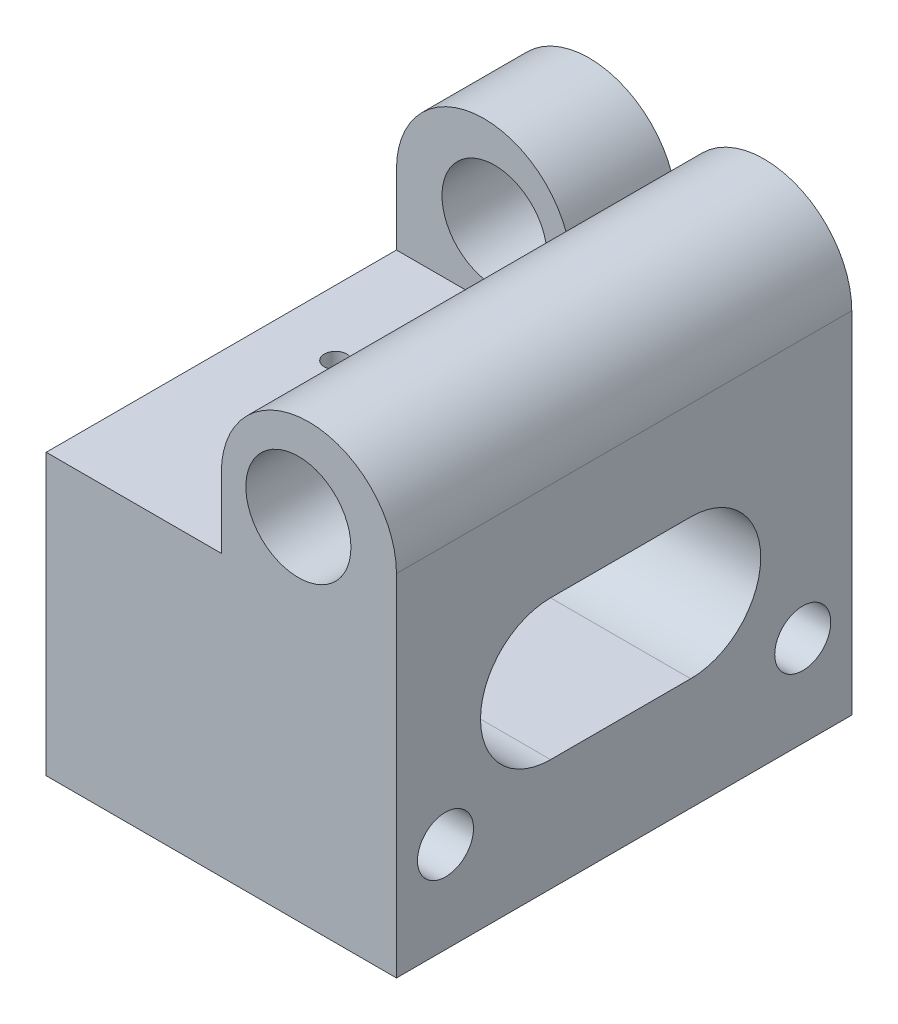
ISO-10303-21;
HEADER;
FILE_DESCRIPTION(('STEP AP214'),'2;1');
FILE_NAME('part.step','',(''),(''),'','','');
FILE_SCHEMA(('AUTOMOTIVE_DESIGN { 1 0 10303 214 1 1 1 1 }'));
ENDSEC;
DATA;
#1=APPLICATION_CONTEXT('core data for automotive mechanical design processes');
#2=APPLICATION_PROTOCOL_DEFINITION('international standard','automotive_design',2000,#1);
#3=PRODUCT_CONTEXT('',#1,'mechanical');
#4=PRODUCT('Part','Part','',(#3));
#5=PRODUCT_RELATED_PRODUCT_CATEGORY('part','',(#4));
#6=PRODUCT_DEFINITION_FORMATION('','',#4);
#7=PRODUCT_DEFINITION_CONTEXT('part definition',#1,'design');
#8=PRODUCT_DEFINITION('design','',#6,#7);
#9=PRODUCT_DEFINITION_SHAPE('','',#8);
#10=(LENGTH_UNIT() NAMED_UNIT(*) SI_UNIT(.MILLI.,.METRE.));
#11=(NAMED_UNIT(*) PLANE_ANGLE_UNIT() SI_UNIT($,.RADIAN.));
#12=(NAMED_UNIT(*) SI_UNIT($,.STERADIAN.) SOLID_ANGLE_UNIT());
#13=UNCERTAINTY_MEASURE_WITH_UNIT(LENGTH_MEASURE(1.E-05),#10,'distance_accuracy_value','');
#14=(GEOMETRIC_REPRESENTATION_CONTEXT(3) GLOBAL_UNCERTAINTY_ASSIGNED_CONTEXT((#13)) GLOBAL_UNIT_ASSIGNED_CONTEXT((#10,
#11,#12)) REPRESENTATION_CONTEXT('',''));
#15=CARTESIAN_POINT('',(0.,0.,0.));
#16=DIRECTION('',(0.,0.,1.));
#17=DIRECTION('',(1.,0.,0.));
#18=AXIS2_PLACEMENT_3D('',#15,#16,#17);
#19=CARTESIAN_POINT('',(36.,50.,0.));
#20=DIRECTION('',(0.,0.,1.));
#21=DIRECTION('',(1.,0.,0.));
#22=AXIS2_PLACEMENT_3D('',#19,#20,#21);
#23=PLANE('',#22);
#24=CARTESIAN_POINT('',(36.,50.,0.));
#25=DIRECTION('',(0.,0.,1.));
#26=DIRECTION('',(1.,0.,0.));
#27=AXIS2_PLACEMENT_3D('',#24,#25,#26);
#28=CIRCLE('',#27,7.5);
#29=CARTESIAN_POINT('',(43.5,50.,0.));
#30=VERTEX_POINT('',#29);
#31=EDGE_CURVE('E171',#30,#30,#28,.T.);
#32=ORIENTED_EDGE('',*,*,#31,.T.);
#33=EDGE_LOOP('',(#32));
#34=FACE_BOUND('',#33,.T.);
#35=CARTESIAN_POINT('',(14.,50.,0.));
#36=DIRECTION('',(0.,0.,1.));
#37=DIRECTION('',(1.,0.,0.));
#38=AXIS2_PLACEMENT_3D('',#35,#36,#37);
#39=CIRCLE('',#38,7.5);
#40=CARTESIAN_POINT('',(21.5,50.,0.));
#41=VERTEX_POINT('',#40);
#42=EDGE_CURVE('E167',#41,#41,#39,.T.);
#43=ORIENTED_EDGE('',*,*,#42,.T.);
#44=EDGE_LOOP('',(#43));
#45=FACE_BOUND('',#44,.T.);
#46=CARTESIAN_POINT('',(37.5,50.,0.));
#47=DIRECTION('',(0.,0.,1.));
#48=DIRECTION('',(1.,0.,0.));
#49=AXIS2_PLACEMENT_3D('',#46,#47,#48);
#50=CIRCLE('',#49,12.5);
#51=CARTESIAN_POINT('',(50.,50.,0.));
#52=VERTEX_POINT('',#51);
#53=CARTESIAN_POINT('',(25.,50.,0.));
#54=VERTEX_POINT('',#53);
#55=EDGE_CURVE('E128',#52,#54,#50,.T.);
#56=ORIENTED_EDGE('',*,*,#55,.F.);
#57=DIRECTION('',(0.,1.,0.));
#58=VECTOR('',#57,1.);
#59=CARTESIAN_POINT('',(50.,0.,0.));
#60=LINE('',#59,#58);
#61=CARTESIAN_POINT('',(50.,0.,0.));
#62=VERTEX_POINT('',#61);
#63=EDGE_CURVE('E142',#62,#52,#60,.T.);
#64=ORIENTED_EDGE('',*,*,#63,.F.);
#65=DIRECTION('',(1.,0.,0.));
#66=VECTOR('',#65,1.);
#67=CARTESIAN_POINT('',(0.,0.,0.));
#68=LINE('',#67,#66);
#69=CARTESIAN_POINT('',(0.,0.,0.));
#70=VERTEX_POINT('',#69);
#71=EDGE_CURVE('E150',#70,#62,#68,.T.);
#72=ORIENTED_EDGE('',*,*,#71,.F.);
#73=DIRECTION('',(0.,-1.,0.));
#74=VECTOR('',#73,1.);
#75=CARTESIAN_POINT('',(0.,50.,0.));
#76=LINE('',#75,#74);
#77=CARTESIAN_POINT('',(0.,50.,0.));
#78=VERTEX_POINT('',#77);
#79=EDGE_CURVE('E154',#78,#70,#76,.T.);
#80=ORIENTED_EDGE('',*,*,#79,.F.);
#81=CARTESIAN_POINT('',(12.5,50.,0.));
#82=DIRECTION('',(0.,0.,1.));
#83=DIRECTION('',(1.,0.,0.));
#84=AXIS2_PLACEMENT_3D('',#81,#82,#83);
#85=CIRCLE('',#84,12.5);
#86=EDGE_CURVE('E144',#78,#54,#85,.F.);
#87=ORIENTED_EDGE('',*,*,#86,.T.);
#88=EDGE_LOOP('',(#56,#64,#72,#80,#87));
#89=FACE_BOUND('',#88,.T.);
#90=ADVANCED_FACE('F38',(#34,#45,#89),#23,.F.);
#91=CARTESIAN_POINT('',(36.,50.,15.));
#92=DIRECTION('',(0.,0.,1.));
#93=DIRECTION('',(1.,0.,0.));
#94=AXIS2_PLACEMENT_3D('',#91,#92,#93);
#95=PLANE('',#94);
#96=CARTESIAN_POINT('',(12.5,50.,15.));
#97=DIRECTION('',(0.,0.,1.));
#98=DIRECTION('',(1.,0.,0.));
#99=AXIS2_PLACEMENT_3D('',#96,#97,#98);
#100=CIRCLE('',#99,12.5);
#101=CARTESIAN_POINT('',(0.,50.,15.));
#102=VERTEX_POINT('',#101);
#103=CARTESIAN_POINT('',(25.,50.,15.));
#104=VERTEX_POINT('',#103);
#105=EDGE_CURVE('E145',#102,#104,#100,.F.);
#106=ORIENTED_EDGE('',*,*,#105,.F.);
#107=DIRECTION('',(0.,-1.,0.));
#108=VECTOR('',#107,1.);
#109=CARTESIAN_POINT('',(0.,50.,15.));
#110=LINE('',#109,#108);
#111=CARTESIAN_POINT('',(0.,40.,15.));
#112=VERTEX_POINT('',#111);
#113=EDGE_CURVE('E149',#102,#112,#110,.T.);
#114=ORIENTED_EDGE('',*,*,#113,.T.);
#115=DIRECTION('',(-1.,0.,0.));
#116=VECTOR('',#115,1.);
#117=CARTESIAN_POINT('',(36.,40.,15.));
#118=LINE('',#117,#116);
#119=CARTESIAN_POINT('',(25.,40.,15.));
#120=VERTEX_POINT('',#119);
#121=EDGE_CURVE('E183',#120,#112,#118,.T.);
#122=ORIENTED_EDGE('',*,*,#121,.F.);
#123=DIRECTION('',(0.,-1.,0.));
#124=VECTOR('',#123,1.);
#125=CARTESIAN_POINT('',(25.,0.,15.));
#126=LINE('',#125,#124);
#127=EDGE_CURVE('E179',#104,#120,#126,.T.);
#128=ORIENTED_EDGE('',*,*,#127,.F.);
#129=EDGE_LOOP('',(#106,#114,#122,#128));
#130=FACE_BOUND('',#129,.T.);
#131=CARTESIAN_POINT('',(14.,50.,15.));
#132=DIRECTION('',(0.,0.,1.));
#133=DIRECTION('',(1.,0.,0.));
#134=AXIS2_PLACEMENT_3D('',#131,#132,#133);
#135=CIRCLE('',#134,7.5);
#136=CARTESIAN_POINT('',(21.5,50.,15.));
#137=VERTEX_POINT('',#136);
#138=EDGE_CURVE('E165',#137,#137,#135,.T.);
#139=ORIENTED_EDGE('',*,*,#138,.F.);
#140=EDGE_LOOP('',(#139));
#141=FACE_BOUND('',#140,.T.);
#142=ADVANCED_FACE('F294',(#130,#141),#95,.T.);
#143=CARTESIAN_POINT('',(0.,50.,15.));
#144=DIRECTION('',(1.,0.,0.));
#145=DIRECTION('',(0.,0.,-1.));
#146=AXIS2_PLACEMENT_3D('',#143,#144,#145);
#147=PLANE('',#146);
#148=CARTESIAN_POINT('',(0.,13.,58.));
#149=DIRECTION('',(-1.,0.,0.));
#150=DIRECTION('',(0.,0.,1.));
#151=AXIS2_PLACEMENT_3D('',#148,#149,#150);
#152=CIRCLE('',#151,4.);
#153=CARTESIAN_POINT('',(0.,13.,62.));
#154=VERTEX_POINT('',#153);
#155=EDGE_CURVE('E245',#154,#154,#152,.T.);
#156=ORIENTED_EDGE('',*,*,#155,.F.);
#157=EDGE_LOOP('',(#156));
#158=FACE_BOUND('',#157,.T.);
#159=CARTESIAN_POINT('',(0.,13.,7.));
#160=DIRECTION('',(-1.,0.,0.));
#161=DIRECTION('',(0.,0.,1.));
#162=AXIS2_PLACEMENT_3D('',#159,#160,#161);
#163=CIRCLE('',#162,4.);
#164=CARTESIAN_POINT('',(0.,13.,11.));
#165=VERTEX_POINT('',#164);
#166=EDGE_CURVE('E238',#165,#165,#163,.T.);
#167=ORIENTED_EDGE('',*,*,#166,.F.);
#168=EDGE_LOOP('',(#167));
#169=FACE_BOUND('',#168,.T.);
#170=DIRECTION('',(0.,0.,1.));
#171=VECTOR('',#170,1.);
#172=CARTESIAN_POINT('',(0.,16.,23.));
#173=LINE('',#172,#171);
#174=CARTESIAN_POINT('',(0.,16.,23.));
#175=VERTEX_POINT('',#174);
#176=CARTESIAN_POINT('',(0.,16.,43.));
#177=VERTEX_POINT('',#176);
#178=EDGE_CURVE('E221',#175,#177,#173,.T.);
#179=ORIENTED_EDGE('',*,*,#178,.F.);
#180=CARTESIAN_POINT('',(0.,26.,23.));
#181=DIRECTION('',(-1.,0.,0.));
#182=DIRECTION('',(0.,0.,1.));
#183=AXIS2_PLACEMENT_3D('',#180,#181,#182);
#184=CIRCLE('',#183,10.);
#185=CARTESIAN_POINT('',(0.,36.,23.));
#186=VERTEX_POINT('',#185);
#187=EDGE_CURVE('E54',#186,#175,#184,.T.);
#188=ORIENTED_EDGE('',*,*,#187,.F.);
#189=DIRECTION('',(0.,0.,-1.));
#190=VECTOR('',#189,1.);
#191=CARTESIAN_POINT('',(0.,36.,23.));
#192=LINE('',#191,#190);
#193=CARTESIAN_POINT('',(0.,36.,43.));
#194=VERTEX_POINT('',#193);
#195=EDGE_CURVE('E214',#194,#186,#192,.T.);
#196=ORIENTED_EDGE('',*,*,#195,.F.);
#197=CARTESIAN_POINT('',(0.,26.,43.));
#198=DIRECTION('',(-1.,0.,0.));
#199=DIRECTION('',(0.,0.,1.));
#200=AXIS2_PLACEMENT_3D('',#197,#198,#199);
#201=CIRCLE('',#200,10.);
#202=EDGE_CURVE('E218',#177,#194,#201,.T.);
#203=ORIENTED_EDGE('',*,*,#202,.F.);
#204=EDGE_LOOP('',(#179,#188,#196,#203));
#205=FACE_BOUND('',#204,.T.);
#206=ORIENTED_EDGE('',*,*,#79,.T.);
#207=DIRECTION('',(0.,0.,-1.));
#208=VECTOR('',#207,1.);
#209=CARTESIAN_POINT('',(0.,0.,15.));
#210=LINE('',#209,#208);
#211=CARTESIAN_POINT('',(0.,0.,65.));
#212=VERTEX_POINT('',#211);
#213=EDGE_CURVE('E11',#212,#70,#210,.T.);
#214=ORIENTED_EDGE('',*,*,#213,.F.);
#215=DIRECTION('',(0.,1.,0.));
#216=VECTOR('',#215,1.);
#217=CARTESIAN_POINT('',(0.,0.,65.));
#218=LINE('',#217,#216);
#219=CARTESIAN_POINT('',(0.,40.,65.));
#220=VERTEX_POINT('',#219);
#221=EDGE_CURVE('E202',#212,#220,#218,.T.);
#222=ORIENTED_EDGE('',*,*,#221,.T.);
#223=DIRECTION('',(0.,0.,-1.));
#224=VECTOR('',#223,1.);
#225=CARTESIAN_POINT('',(0.,40.,65.));
#226=LINE('',#225,#224);
#227=EDGE_CURVE('E198',#220,#112,#226,.T.);
#228=ORIENTED_EDGE('',*,*,#227,.T.);
#229=ORIENTED_EDGE('',*,*,#113,.F.);
#230=DIRECTION('',(0.,0.,-1.));
#231=VECTOR('',#230,1.);
#232=CARTESIAN_POINT('',(0.,50.,15.));
#233=LINE('',#232,#231);
#234=EDGE_CURVE('E136',#102,#78,#233,.T.);
#235=ORIENTED_EDGE('',*,*,#234,.T.);
#236=EDGE_LOOP('',(#206,#214,#222,#228,#229,#235));
#237=FACE_BOUND('',#236,.T.);
#238=ADVANCED_FACE('F40',(#158,#169,#205,#237),#147,.F.);
#239=CARTESIAN_POINT('',(0.,0.,15.));
#240=DIRECTION('',(0.,1.,0.));
#241=DIRECTION('',(0.,0.,1.));
#242=AXIS2_PLACEMENT_3D('',#239,#240,#241);
#243=PLANE('',#242);
#244=CARTESIAN_POINT('',(9.30614492508849,0.,33.));
#245=DIRECTION('',(0.,1.,0.));
#246=DIRECTION('',(0.,0.,1.));
#247=AXIS2_PLACEMENT_3D('',#244,#245,#246);
#248=CIRCLE('',#247,1.6);
#249=CARTESIAN_POINT('',(9.30614492508849,0.,34.6));
#250=VERTEX_POINT('',#249);
#251=EDGE_CURVE('E255',#250,#250,#248,.T.);
#252=ORIENTED_EDGE('',*,*,#251,.T.);
#253=EDGE_LOOP('',(#252));
#254=FACE_BOUND('',#253,.T.);
#255=ORIENTED_EDGE('',*,*,#71,.T.);
#256=DIRECTION('',(0.,0.,-1.));
#257=VECTOR('',#256,1.);
#258=CARTESIAN_POINT('',(50.,0.,15.));
#259=LINE('',#258,#257);
#260=CARTESIAN_POINT('',(50.,0.,65.));
#261=VERTEX_POINT('',#260);
#262=EDGE_CURVE('E47',#261,#62,#259,.T.);
#263=ORIENTED_EDGE('',*,*,#262,.F.);
#264=DIRECTION('',(1.,0.,0.));
#265=VECTOR('',#264,1.);
#266=CARTESIAN_POINT('',(0.,0.,65.));
#267=LINE('',#266,#265);
#268=EDGE_CURVE('E178',#212,#261,#267,.T.);
#269=ORIENTED_EDGE('',*,*,#268,.F.);
#270=ORIENTED_EDGE('',*,*,#213,.T.);
#271=EDGE_LOOP('',(#255,#263,#269,#270));
#272=FACE_BOUND('',#271,.T.);
#273=ADVANCED_FACE('F307',(#254,#272),#243,.F.);
#274=CARTESIAN_POINT('',(50.,0.,15.));
#275=DIRECTION('',(-1.,0.,0.));
#276=DIRECTION('',(0.,0.,1.));
#277=AXIS2_PLACEMENT_3D('',#274,#275,#276);
#278=PLANE('',#277);
#279=CARTESIAN_POINT('',(50.,13.,58.));
#280=DIRECTION('',(-1.,0.,0.));
#281=DIRECTION('',(0.,0.,1.));
#282=AXIS2_PLACEMENT_3D('',#279,#280,#281);
#283=CIRCLE('',#282,4.);
#284=CARTESIAN_POINT('',(50.,13.,62.));
#285=VERTEX_POINT('',#284);
#286=EDGE_CURVE('E236',#285,#285,#283,.T.);
#287=ORIENTED_EDGE('',*,*,#286,.T.);
#288=EDGE_LOOP('',(#287));
#289=FACE_BOUND('',#288,.T.);
#290=CARTESIAN_POINT('',(50.,13.,7.));
#291=DIRECTION('',(-1.,0.,0.));
#292=DIRECTION('',(0.,0.,1.));
#293=AXIS2_PLACEMENT_3D('',#290,#291,#292);
#294=CIRCLE('',#293,4.);
#295=CARTESIAN_POINT('',(50.,13.,11.));
#296=VERTEX_POINT('',#295);
#297=EDGE_CURVE('E241',#296,#296,#294,.T.);
#298=ORIENTED_EDGE('',*,*,#297,.T.);
#299=EDGE_LOOP('',(#298));
#300=FACE_BOUND('',#299,.T.);
#301=DIRECTION('',(0.,0.,-1.));
#302=VECTOR('',#301,1.);
#303=CARTESIAN_POINT('',(50.,36.,23.));
#304=LINE('',#303,#302);
#305=CARTESIAN_POINT('',(50.,36.,43.));
#306=VERTEX_POINT('',#305);
#307=CARTESIAN_POINT('',(50.,36.,23.));
#308=VERTEX_POINT('',#307);
#309=EDGE_CURVE('E209',#306,#308,#304,.T.);
#310=ORIENTED_EDGE('',*,*,#309,.T.);
#311=CARTESIAN_POINT('',(50.,26.,23.));
#312=DIRECTION('',(-1.,0.,0.));
#313=DIRECTION('',(0.,0.,1.));
#314=AXIS2_PLACEMENT_3D('',#311,#312,#313);
#315=CIRCLE('',#314,10.);
#316=CARTESIAN_POINT('',(50.,16.,23.));
#317=VERTEX_POINT('',#316);
#318=EDGE_CURVE('E217',#308,#317,#315,.T.);
#319=ORIENTED_EDGE('',*,*,#318,.T.);
#320=DIRECTION('',(0.,0.,1.));
#321=VECTOR('',#320,1.);
#322=CARTESIAN_POINT('',(50.,16.,23.));
#323=LINE('',#322,#321);
#324=CARTESIAN_POINT('',(50.,16.,43.));
#325=VERTEX_POINT('',#324);
#326=EDGE_CURVE('E229',#317,#325,#323,.T.);
#327=ORIENTED_EDGE('',*,*,#326,.T.);
#328=CARTESIAN_POINT('',(50.,26.,43.));
#329=DIRECTION('',(-1.,0.,0.));
#330=DIRECTION('',(0.,0.,1.));
#331=AXIS2_PLACEMENT_3D('',#328,#329,#330);
#332=CIRCLE('',#331,10.);
#333=EDGE_CURVE('E62',#325,#306,#332,.T.);
#334=ORIENTED_EDGE('',*,*,#333,.T.);
#335=EDGE_LOOP('',(#310,#319,#327,#334));
#336=FACE_BOUND('',#335,.T.);
#337=DIRECTION('',(0.,0.,-1.));
#338=VECTOR('',#337,1.);
#339=CARTESIAN_POINT('',(50.,50.,15.));
#340=LINE('',#339,#338);
#341=CARTESIAN_POINT('',(50.,50.,65.));
#342=VERTEX_POINT('',#341);
#343=EDGE_CURVE('E124',#342,#52,#340,.T.);
#344=ORIENTED_EDGE('',*,*,#343,.F.);
#345=DIRECTION('',(0.,1.,0.));
#346=VECTOR('',#345,1.);
#347=CARTESIAN_POINT('',(50.,0.,65.));
#348=LINE('',#347,#346);
#349=EDGE_CURVE('E190',#261,#342,#348,.T.);
#350=ORIENTED_EDGE('',*,*,#349,.F.);
#351=ORIENTED_EDGE('',*,*,#262,.T.);
#352=ORIENTED_EDGE('',*,*,#63,.T.);
#353=EDGE_LOOP('',(#344,#350,#351,#352));
#354=FACE_BOUND('',#353,.T.);
#355=ADVANCED_FACE('F148',(#289,#300,#336,#354),#278,.F.);
#356=CARTESIAN_POINT('',(14.,50.,15.));
#357=DIRECTION('',(0.,0.,-1.));
#358=DIRECTION('',(-1.,0.,0.));
#359=AXIS2_PLACEMENT_3D('',#356,#357,#358);
#360=CYLINDRICAL_SURFACE('',#359,7.5);
#361=ORIENTED_EDGE('',*,*,#138,.T.);
#362=EDGE_LOOP('',(#361));
#363=FACE_BOUND('',#362,.T.);
#364=ORIENTED_EDGE('',*,*,#42,.F.);
#365=EDGE_LOOP('',(#364));
#366=FACE_BOUND('',#365,.T.);
#367=ADVANCED_FACE('F306',(#363,#366),#360,.F.);
#368=CARTESIAN_POINT('',(36.,50.,15.));
#369=DIRECTION('',(0.,0.,-1.));
#370=DIRECTION('',(-1.,0.,0.));
#371=AXIS2_PLACEMENT_3D('',#368,#369,#370);
#372=CYLINDRICAL_SURFACE('',#371,7.5);
#373=ORIENTED_EDGE('',*,*,#31,.F.);
#374=EDGE_LOOP('',(#373));
#375=FACE_BOUND('',#374,.T.);
#376=CARTESIAN_POINT('',(36.,50.,65.));
#377=DIRECTION('',(0.,0.,1.));
#378=DIRECTION('',(1.,0.,0.));
#379=AXIS2_PLACEMENT_3D('',#376,#377,#378);
#380=CIRCLE('',#379,7.5);
#381=CARTESIAN_POINT('',(43.5,50.,65.));
#382=VERTEX_POINT('',#381);
#383=EDGE_CURVE('E182',#382,#382,#380,.F.);
#384=ORIENTED_EDGE('',*,*,#383,.F.);
#385=EDGE_LOOP('',(#384));
#386=FACE_BOUND('',#385,.T.);
#387=ADVANCED_FACE('F432',(#375,#386),#372,.F.);
#388=CARTESIAN_POINT('',(37.5,50.,65.));
#389=DIRECTION('',(0.,0.,-1.));
#390=DIRECTION('',(-1.,0.,0.));
#391=AXIS2_PLACEMENT_3D('',#388,#389,#390);
#392=CYLINDRICAL_SURFACE('',#391,12.5);
#393=CARTESIAN_POINT('',(37.5,50.,65.));
#394=DIRECTION('',(0.,0.,1.));
#395=DIRECTION('',(1.,0.,0.));
#396=AXIS2_PLACEMENT_3D('',#393,#394,#395);
#397=CIRCLE('',#396,12.5);
#398=CARTESIAN_POINT('',(25.,50.,65.));
#399=VERTEX_POINT('',#398);
#400=EDGE_CURVE('E131',#342,#399,#397,.T.);
#401=ORIENTED_EDGE('',*,*,#400,.F.);
#402=ORIENTED_EDGE('',*,*,#343,.T.);
#403=ORIENTED_EDGE('',*,*,#55,.T.);
#404=DIRECTION('',(0.,0.,1.));
#405=VECTOR('',#404,1.);
#406=CARTESIAN_POINT('',(25.,50.,0.));
#407=LINE('',#406,#405);
#408=EDGE_CURVE('E225',#54,#104,#407,.T.);
#409=ORIENTED_EDGE('',*,*,#408,.T.);
#410=DIRECTION('',(0.,0.,-1.));
#411=VECTOR('',#410,1.);
#412=CARTESIAN_POINT('',(25.,50.,65.));
#413=LINE('',#412,#411);
#414=EDGE_CURVE('E175',#399,#104,#413,.T.);
#415=ORIENTED_EDGE('',*,*,#414,.F.);
#416=EDGE_LOOP('',(#401,#402,#403,#409,#415));
#417=FACE_BOUND('',#416,.T.);
#418=ADVANCED_FACE('F126',(#417),#392,.T.);
#419=CARTESIAN_POINT('',(25.,0.,65.));
#420=DIRECTION('',(1.,0.,0.));
#421=DIRECTION('',(0.,0.,-1.));
#422=AXIS2_PLACEMENT_3D('',#419,#420,#421);
#423=PLANE('',#422);
#424=ORIENTED_EDGE('',*,*,#127,.T.);
#425=DIRECTION('',(0.,0.,1.));
#426=VECTOR('',#425,1.);
#427=CARTESIAN_POINT('',(25.,40.,65.));
#428=LINE('',#427,#426);
#429=CARTESIAN_POINT('',(25.,40.,65.));
#430=VERTEX_POINT('',#429);
#431=EDGE_CURVE('E195',#120,#430,#428,.T.);
#432=ORIENTED_EDGE('',*,*,#431,.T.);
#433=DIRECTION('',(0.,-1.,0.));
#434=VECTOR('',#433,1.);
#435=CARTESIAN_POINT('',(25.,0.,65.));
#436=LINE('',#435,#434);
#437=EDGE_CURVE('E186',#399,#430,#436,.T.);
#438=ORIENTED_EDGE('',*,*,#437,.F.);
#439=ORIENTED_EDGE('',*,*,#414,.T.);
#440=EDGE_LOOP('',(#424,#432,#438,#439));
#441=FACE_BOUND('',#440,.T.);
#442=ADVANCED_FACE('F324',(#441),#423,.F.);
#443=CARTESIAN_POINT('',(0.,0.,65.));
#444=DIRECTION('',(0.,0.,1.));
#445=DIRECTION('',(1.,0.,0.));
#446=AXIS2_PLACEMENT_3D('',#443,#444,#445);
#447=PLANE('',#446);
#448=ORIENTED_EDGE('',*,*,#437,.T.);
#449=DIRECTION('',(1.,0.,0.));
#450=VECTOR('',#449,1.);
#451=CARTESIAN_POINT('',(50.,40.,65.));
#452=LINE('',#451,#450);
#453=EDGE_CURVE('E200',#220,#430,#452,.T.);
#454=ORIENTED_EDGE('',*,*,#453,.F.);
#455=ORIENTED_EDGE('',*,*,#221,.F.);
#456=ORIENTED_EDGE('',*,*,#268,.T.);
#457=ORIENTED_EDGE('',*,*,#349,.T.);
#458=ORIENTED_EDGE('',*,*,#400,.T.);
#459=EDGE_LOOP('',(#448,#454,#455,#456,#457,#458));
#460=FACE_BOUND('',#459,.T.);
#461=ORIENTED_EDGE('',*,*,#383,.T.);
#462=EDGE_LOOP('',(#461));
#463=FACE_BOUND('',#462,.T.);
#464=ADVANCED_FACE('F290',(#460,#463),#447,.T.);
#465=CARTESIAN_POINT('',(50.,40.,65.));
#466=DIRECTION('',(0.,1.,0.));
#467=DIRECTION('',(0.,0.,1.));
#468=AXIS2_PLACEMENT_3D('',#465,#466,#467);
#469=PLANE('',#468);
#470=CARTESIAN_POINT('',(9.30614492508849,40.,33.));
#471=DIRECTION('',(0.,1.,0.));
#472=DIRECTION('',(0.,0.,1.));
#473=AXIS2_PLACEMENT_3D('',#470,#471,#472);
#474=CIRCLE('',#473,1.6);
#475=CARTESIAN_POINT('',(9.30614492508849,40.,34.6));
#476=VERTEX_POINT('',#475);
#477=EDGE_CURVE('E242',#476,#476,#474,.F.);
#478=ORIENTED_EDGE('',*,*,#477,.T.);
#479=EDGE_LOOP('',(#478));
#480=FACE_BOUND('',#479,.T.);
#481=ORIENTED_EDGE('',*,*,#431,.F.);
#482=ORIENTED_EDGE('',*,*,#121,.T.);
#483=ORIENTED_EDGE('',*,*,#227,.F.);
#484=ORIENTED_EDGE('',*,*,#453,.T.);
#485=EDGE_LOOP('',(#481,#482,#483,#484));
#486=FACE_BOUND('',#485,.T.);
#487=ADVANCED_FACE('F282',(#480,#486),#469,.T.);
#488=CARTESIAN_POINT('',(50.,26.,23.));
#489=DIRECTION('',(-1.,0.,0.));
#490=DIRECTION('',(0.,0.,1.));
#491=AXIS2_PLACEMENT_3D('',#488,#489,#490);
#492=CYLINDRICAL_SURFACE('',#491,10.);
#493=ORIENTED_EDGE('',*,*,#187,.T.);
#494=DIRECTION('',(-1.,0.,0.));
#495=VECTOR('',#494,1.);
#496=CARTESIAN_POINT('',(50.,16.,23.));
#497=LINE('',#496,#495);
#498=EDGE_CURVE('E206',#317,#175,#497,.T.);
#499=ORIENTED_EDGE('',*,*,#498,.F.);
#500=ORIENTED_EDGE('',*,*,#318,.F.);
#501=DIRECTION('',(-1.,0.,0.));
#502=VECTOR('',#501,1.);
#503=CARTESIAN_POINT('',(50.,36.,23.));
#504=LINE('',#503,#502);
#505=EDGE_CURVE('E205',#308,#186,#504,.T.);
#506=ORIENTED_EDGE('',*,*,#505,.T.);
#507=EDGE_LOOP('',(#493,#499,#500,#506));
#508=FACE_BOUND('',#507,.T.);
#509=ADVANCED_FACE('F280',(#508),#492,.F.);
#510=CARTESIAN_POINT('',(50.,36.,23.));
#511=DIRECTION('',(0.,1.,0.));
#512=DIRECTION('',(0.,0.,1.));
#513=AXIS2_PLACEMENT_3D('',#510,#511,#512);
#514=PLANE('',#513);
#515=CARTESIAN_POINT('',(9.30614492508849,36.,33.));
#516=DIRECTION('',(0.,1.,0.));
#517=DIRECTION('',(0.,0.,1.));
#518=AXIS2_PLACEMENT_3D('',#515,#516,#517);
#519=CIRCLE('',#518,1.6);
#520=CARTESIAN_POINT('',(9.30614492508849,36.,34.6));
#521=VERTEX_POINT('',#520);
#522=EDGE_CURVE('E252',#521,#521,#519,.F.);
#523=ORIENTED_EDGE('',*,*,#522,.F.);
#524=EDGE_LOOP('',(#523));
#525=FACE_BOUND('',#524,.T.);
#526=ORIENTED_EDGE('',*,*,#195,.T.);
#527=ORIENTED_EDGE('',*,*,#505,.F.);
#528=ORIENTED_EDGE('',*,*,#309,.F.);
#529=DIRECTION('',(-1.,0.,0.));
#530=VECTOR('',#529,1.);
#531=CARTESIAN_POINT('',(50.,36.,43.));
#532=LINE('',#531,#530);
#533=EDGE_CURVE('E211',#306,#194,#532,.T.);
#534=ORIENTED_EDGE('',*,*,#533,.T.);
#535=EDGE_LOOP('',(#526,#527,#528,#534));
#536=FACE_BOUND('',#535,.T.);
#537=ADVANCED_FACE('F277',(#525,#536),#514,.F.);
#538=CARTESIAN_POINT('',(50.,26.,43.));
#539=DIRECTION('',(-1.,0.,0.));
#540=DIRECTION('',(0.,0.,1.));
#541=AXIS2_PLACEMENT_3D('',#538,#539,#540);
#542=CYLINDRICAL_SURFACE('',#541,10.);
#543=ORIENTED_EDGE('',*,*,#202,.T.);
#544=ORIENTED_EDGE('',*,*,#533,.F.);
#545=ORIENTED_EDGE('',*,*,#333,.F.);
#546=DIRECTION('',(-1.,0.,0.));
#547=VECTOR('',#546,1.);
#548=CARTESIAN_POINT('',(50.,16.,43.));
#549=LINE('',#548,#547);
#550=EDGE_CURVE('E208',#325,#177,#549,.T.);
#551=ORIENTED_EDGE('',*,*,#550,.T.);
#552=EDGE_LOOP('',(#543,#544,#545,#551));
#553=FACE_BOUND('',#552,.T.);
#554=ADVANCED_FACE('F268',(#553),#542,.F.);
#555=CARTESIAN_POINT('',(50.,16.,23.));
#556=DIRECTION('',(0.,-1.,0.));
#557=DIRECTION('',(0.,0.,-1.));
#558=AXIS2_PLACEMENT_3D('',#555,#556,#557);
#559=PLANE('',#558);
#560=CARTESIAN_POINT('',(9.30614492508849,16.,33.));
#561=DIRECTION('',(0.,-1.,0.));
#562=DIRECTION('',(0.,0.,-1.));
#563=AXIS2_PLACEMENT_3D('',#560,#561,#562);
#564=CIRCLE('',#563,1.6);
#565=CARTESIAN_POINT('',(9.30614492508849,16.,31.4));
#566=VERTEX_POINT('',#565);
#567=EDGE_CURVE('E42',#566,#566,#564,.F.);
#568=ORIENTED_EDGE('',*,*,#567,.F.);
#569=EDGE_LOOP('',(#568));
#570=FACE_BOUND('',#569,.T.);
#571=ORIENTED_EDGE('',*,*,#178,.T.);
#572=ORIENTED_EDGE('',*,*,#550,.F.);
#573=ORIENTED_EDGE('',*,*,#326,.F.);
#574=ORIENTED_EDGE('',*,*,#498,.T.);
#575=EDGE_LOOP('',(#571,#572,#573,#574));
#576=FACE_BOUND('',#575,.T.);
#577=ADVANCED_FACE('F264',(#570,#576),#559,.F.);
#578=CARTESIAN_POINT('',(12.5,50.,0.));
#579=DIRECTION('',(0.,0.,1.));
#580=DIRECTION('',(1.,0.,0.));
#581=AXIS2_PLACEMENT_3D('',#578,#579,#580);
#582=CYLINDRICAL_SURFACE('',#581,12.5);
#583=ORIENTED_EDGE('',*,*,#105,.T.);
#584=ORIENTED_EDGE('',*,*,#408,.F.);
#585=ORIENTED_EDGE('',*,*,#86,.F.);
#586=ORIENTED_EDGE('',*,*,#234,.F.);
#587=EDGE_LOOP('',(#583,#584,#585,#586));
#588=FACE_BOUND('',#587,.T.);
#589=ADVANCED_FACE('F267',(#588),#582,.T.);
#590=CARTESIAN_POINT('',(50.,13.,7.));
#591=DIRECTION('',(-1.,0.,0.));
#592=DIRECTION('',(0.,0.,1.));
#593=AXIS2_PLACEMENT_3D('',#590,#591,#592);
#594=CYLINDRICAL_SURFACE('',#593,4.);
#595=ORIENTED_EDGE('',*,*,#297,.F.);
#596=EDGE_LOOP('',(#595));
#597=FACE_BOUND('',#596,.T.);
#598=ORIENTED_EDGE('',*,*,#166,.T.);
#599=EDGE_LOOP('',(#598));
#600=FACE_BOUND('',#599,.T.);
#601=ADVANCED_FACE('F328',(#597,#600),#594,.F.);
#602=CARTESIAN_POINT('',(50.,13.,58.));
#603=DIRECTION('',(-1.,0.,0.));
#604=DIRECTION('',(0.,0.,1.));
#605=AXIS2_PLACEMENT_3D('',#602,#603,#604);
#606=CYLINDRICAL_SURFACE('',#605,4.);
#607=ORIENTED_EDGE('',*,*,#286,.F.);
#608=EDGE_LOOP('',(#607));
#609=FACE_BOUND('',#608,.T.);
#610=ORIENTED_EDGE('',*,*,#155,.T.);
#611=EDGE_LOOP('',(#610));
#612=FACE_BOUND('',#611,.T.);
#613=ADVANCED_FACE('F333',(#609,#612),#606,.F.);
#614=CARTESIAN_POINT('',(9.30614492508849,62.5,33.));
#615=DIRECTION('',(0.,-1.,0.));
#616=DIRECTION('',(0.,0.,-1.));
#617=AXIS2_PLACEMENT_3D('',#614,#615,#616);
#618=CYLINDRICAL_SURFACE('',#617,1.6);
#619=ORIENTED_EDGE('',*,*,#251,.F.);
#620=EDGE_LOOP('',(#619));
#621=FACE_BOUND('',#620,.T.);
#622=ORIENTED_EDGE('',*,*,#567,.T.);
#623=EDGE_LOOP('',(#622));
#624=FACE_BOUND('',#623,.T.);
#625=ADVANCED_FACE('F262',(#621,#624),#618,.F.);
#626=ORIENTED_EDGE('',*,*,#477,.F.);
#627=EDGE_LOOP('',(#626));
#628=FACE_BOUND('',#627,.T.);
#629=ORIENTED_EDGE('',*,*,#522,.T.);
#630=EDGE_LOOP('',(#629));
#631=FACE_BOUND('',#630,.T.);
#632=ADVANCED_FACE('F360',(#628,#631),#618,.F.);
#633=CLOSED_SHELL('',(#90,#142,#238,#273,#355,#367,#387,#418,#442,#464,#487,#509,#537,#554,#577,
#589,#601,#613,#625,#632));
#634=MANIFOLD_SOLID_BREP('B2',#633);
#635=ADVANCED_BREP_SHAPE_REPRESENTATION('',(#18,#634),#14);
#636=SHAPE_DEFINITION_REPRESENTATION(#9,#635);
ENDSEC;
END-ISO-10303-21;
